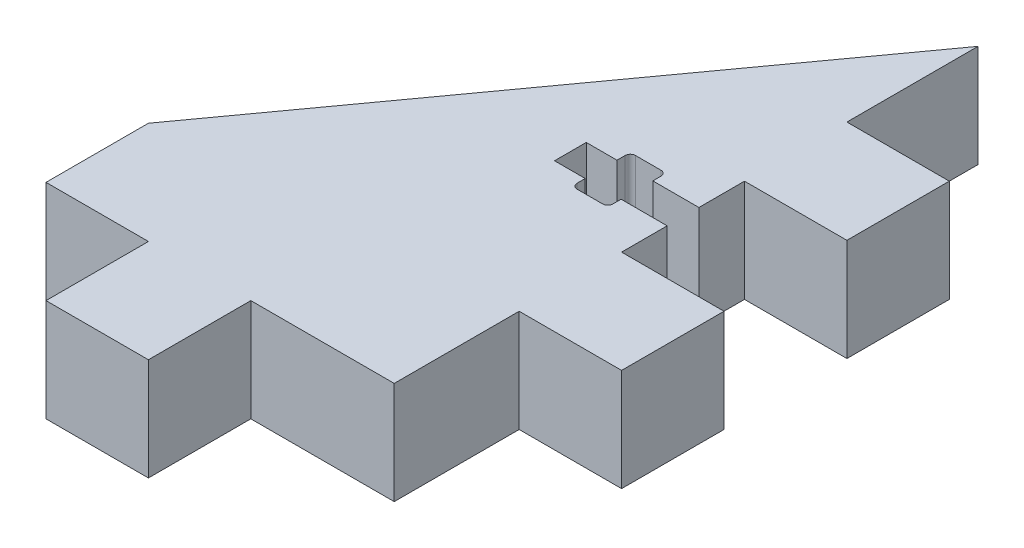
ISO-10303-21;
HEADER;
FILE_DESCRIPTION(('STEP AP214'),'2;1');
FILE_NAME('part.step','',(''),(''),'','','');
FILE_SCHEMA(('AUTOMOTIVE_DESIGN { 1 0 10303 214 1 1 1 1 }'));
ENDSEC;
DATA;
#1=APPLICATION_CONTEXT('core data for automotive mechanical design processes');
#2=APPLICATION_PROTOCOL_DEFINITION('international standard','automotive_design',2000,#1);
#3=PRODUCT_CONTEXT('',#1,'mechanical');
#4=PRODUCT('Part','Part','',(#3));
#5=PRODUCT_RELATED_PRODUCT_CATEGORY('part','',(#4));
#6=PRODUCT_DEFINITION_FORMATION('','',#4);
#7=PRODUCT_DEFINITION_CONTEXT('part definition',#1,'design');
#8=PRODUCT_DEFINITION('design','',#6,#7);
#9=PRODUCT_DEFINITION_SHAPE('','',#8);
#10=(LENGTH_UNIT() NAMED_UNIT(*) SI_UNIT(.MILLI.,.METRE.));
#11=(NAMED_UNIT(*) PLANE_ANGLE_UNIT() SI_UNIT($,.RADIAN.));
#12=(NAMED_UNIT(*) SI_UNIT($,.STERADIAN.) SOLID_ANGLE_UNIT());
#13=UNCERTAINTY_MEASURE_WITH_UNIT(LENGTH_MEASURE(1.E-05),#10,'distance_accuracy_value','');
#14=(GEOMETRIC_REPRESENTATION_CONTEXT(3) GLOBAL_UNCERTAINTY_ASSIGNED_CONTEXT((#13)) GLOBAL_UNIT_ASSIGNED_CONTEXT((#10,
#11,#12)) REPRESENTATION_CONTEXT('',''));
#15=CARTESIAN_POINT('',(0.,0.,0.));
#16=DIRECTION('',(0.,0.,1.));
#17=DIRECTION('',(1.,0.,0.));
#18=AXIS2_PLACEMENT_3D('',#15,#16,#17);
#19=CARTESIAN_POINT('',(0.,10.,-34.2));
#20=DIRECTION('',(-1.,0.,0.));
#21=DIRECTION('',(0.,0.,1.));
#22=AXIS2_PLACEMENT_3D('',#19,#20,#21);
#23=PLANE('',#22);
#24=DIRECTION('',(0.,0.,-1.));
#25=VECTOR('',#24,1.);
#26=CARTESIAN_POINT('',(0.,10.,-34.2));
#27=LINE('',#26,#25);
#28=CARTESIAN_POINT('',(0.,10.,-29.75));
#29=VERTEX_POINT('',#28);
#30=CARTESIAN_POINT('',(0.,10.,-34.2));
#31=VERTEX_POINT('',#30);
#32=EDGE_CURVE('E288',#29,#31,#27,.T.);
#33=ORIENTED_EDGE('',*,*,#32,.F.);
#34=DIRECTION('',(0.,1.,0.));
#35=VECTOR('',#34,1.);
#36=CARTESIAN_POINT('',(0.,0.,-29.75));
#37=LINE('',#36,#35);
#38=CARTESIAN_POINT('',(0.,0.,-29.75));
#39=VERTEX_POINT('',#38);
#40=EDGE_CURVE('E354',#39,#29,#37,.T.);
#41=ORIENTED_EDGE('',*,*,#40,.F.);
#42=DIRECTION('',(0.,0.,-1.));
#43=VECTOR('',#42,1.);
#44=CARTESIAN_POINT('',(0.,0.,-34.2));
#45=LINE('',#44,#43);
#46=CARTESIAN_POINT('',(0.,0.,-34.2));
#47=VERTEX_POINT('',#46);
#48=EDGE_CURVE('E201',#39,#47,#45,.T.);
#49=ORIENTED_EDGE('',*,*,#48,.T.);
#50=DIRECTION('',(0.,-1.,0.));
#51=VECTOR('',#50,1.);
#52=CARTESIAN_POINT('',(0.,10.,-34.2));
#53=LINE('',#52,#51);
#54=EDGE_CURVE('E250',#31,#47,#53,.T.);
#55=ORIENTED_EDGE('',*,*,#54,.F.);
#56=EDGE_LOOP('',(#33,#41,#49,#55));
#57=FACE_BOUND('',#56,.T.);
#58=ADVANCED_FACE('F33',(#57),#23,.F.);
#59=CARTESIAN_POINT('',(0.,10.,-12.2));
#60=DIRECTION('',(-1.,0.,0.));
#61=DIRECTION('',(0.,0.,1.));
#62=AXIS2_PLACEMENT_3D('',#59,#60,#61);
#63=PLANE('',#62);
#64=DIRECTION('',(0.,0.,-1.));
#65=VECTOR('',#64,1.);
#66=CARTESIAN_POINT('',(0.,0.,-12.2));
#67=LINE('',#66,#65);
#68=CARTESIAN_POINT('',(0.,0.,0.));
#69=VERTEX_POINT('',#68);
#70=CARTESIAN_POINT('',(0.,0.,-12.2));
#71=VERTEX_POINT('',#70);
#72=EDGE_CURVE('E191',#69,#71,#67,.T.);
#73=ORIENTED_EDGE('',*,*,#72,.T.);
#74=DIRECTION('',(0.,-1.,0.));
#75=VECTOR('',#74,1.);
#76=CARTESIAN_POINT('',(0.,10.,-12.2));
#77=LINE('',#76,#75);
#78=CARTESIAN_POINT('',(0.,10.,-12.2));
#79=VERTEX_POINT('',#78);
#80=EDGE_CURVE('E11',#79,#71,#77,.T.);
#81=ORIENTED_EDGE('',*,*,#80,.F.);
#82=DIRECTION('',(0.,0.,-1.));
#83=VECTOR('',#82,1.);
#84=CARTESIAN_POINT('',(0.,10.,-12.2));
#85=LINE('',#84,#83);
#86=CARTESIAN_POINT('',(0.,10.,0.));
#87=VERTEX_POINT('',#86);
#88=EDGE_CURVE('E225',#87,#79,#85,.T.);
#89=ORIENTED_EDGE('',*,*,#88,.F.);
#90=DIRECTION('',(0.,-1.,0.));
#91=VECTOR('',#90,1.);
#92=CARTESIAN_POINT('',(0.,10.,0.));
#93=LINE('',#92,#91);
#94=EDGE_CURVE('E187',#87,#69,#93,.T.);
#95=ORIENTED_EDGE('',*,*,#94,.T.);
#96=EDGE_LOOP('',(#73,#81,#89,#95));
#97=FACE_BOUND('',#96,.T.);
#98=ADVANCED_FACE('F35',(#97),#63,.F.);
#99=CARTESIAN_POINT('',(10.,10.,-12.2));
#100=DIRECTION('',(0.,0.,-1.));
#101=DIRECTION('',(-1.,0.,0.));
#102=AXIS2_PLACEMENT_3D('',#99,#100,#101);
#103=PLANE('',#102);
#104=DIRECTION('',(1.,0.,0.));
#105=VECTOR('',#104,1.);
#106=CARTESIAN_POINT('',(10.,0.,-12.2));
#107=LINE('',#106,#105);
#108=CARTESIAN_POINT('',(10.,0.,-12.2));
#109=VERTEX_POINT('',#108);
#110=EDGE_CURVE('E194',#71,#109,#107,.T.);
#111=ORIENTED_EDGE('',*,*,#110,.T.);
#112=DIRECTION('',(0.,-1.,0.));
#113=VECTOR('',#112,1.);
#114=CARTESIAN_POINT('',(10.,10.,-12.2));
#115=LINE('',#114,#113);
#116=CARTESIAN_POINT('',(10.,10.,-12.2));
#117=VERTEX_POINT('',#116);
#118=EDGE_CURVE('E41',#117,#109,#115,.T.);
#119=ORIENTED_EDGE('',*,*,#118,.F.);
#120=DIRECTION('',(1.,0.,0.));
#121=VECTOR('',#120,1.);
#122=CARTESIAN_POINT('',(10.,10.,-12.2));
#123=LINE('',#122,#121);
#124=EDGE_CURVE('E122',#79,#117,#123,.T.);
#125=ORIENTED_EDGE('',*,*,#124,.F.);
#126=ORIENTED_EDGE('',*,*,#80,.T.);
#127=EDGE_LOOP('',(#111,#119,#125,#126));
#128=FACE_BOUND('',#127,.T.);
#129=ADVANCED_FACE('F598',(#128),#103,.F.);
#130=CARTESIAN_POINT('',(9.99999999999999,10.,-22.2));
#131=DIRECTION('',(-1.,0.,0.));
#132=DIRECTION('',(0.,0.,1.));
#133=AXIS2_PLACEMENT_3D('',#130,#131,#132);
#134=PLANE('',#133);
#135=DIRECTION('',(0.,0.,-1.));
#136=VECTOR('',#135,1.);
#137=CARTESIAN_POINT('',(9.99999999999999,0.,-22.2));
#138=LINE('',#137,#136);
#139=CARTESIAN_POINT('',(9.99999999999999,0.,-22.2));
#140=VERTEX_POINT('',#139);
#141=EDGE_CURVE('E197',#109,#140,#138,.T.);
#142=ORIENTED_EDGE('',*,*,#141,.T.);
#143=DIRECTION('',(0.,-1.,0.));
#144=VECTOR('',#143,1.);
#145=CARTESIAN_POINT('',(9.99999999999999,10.,-22.2));
#146=LINE('',#145,#144);
#147=CARTESIAN_POINT('',(9.99999999999999,10.,-22.2));
#148=VERTEX_POINT('',#147);
#149=EDGE_CURVE('E256',#148,#140,#146,.T.);
#150=ORIENTED_EDGE('',*,*,#149,.F.);
#151=DIRECTION('',(0.,0.,-1.));
#152=VECTOR('',#151,1.);
#153=CARTESIAN_POINT('',(9.99999999999999,10.,-22.2));
#154=LINE('',#153,#152);
#155=EDGE_CURVE('E264',#117,#148,#154,.T.);
#156=ORIENTED_EDGE('',*,*,#155,.F.);
#157=ORIENTED_EDGE('',*,*,#118,.T.);
#158=EDGE_LOOP('',(#142,#150,#156,#157));
#159=FACE_BOUND('',#158,.T.);
#160=ADVANCED_FACE('F262',(#159),#134,.F.);
#161=CARTESIAN_POINT('',(0.,10.,-22.2));
#162=DIRECTION('',(0.,0.,1.));
#163=DIRECTION('',(1.,0.,0.));
#164=AXIS2_PLACEMENT_3D('',#161,#162,#163);
#165=PLANE('',#164);
#166=DIRECTION('',(-1.,0.,0.));
#167=VECTOR('',#166,1.);
#168=CARTESIAN_POINT('',(0.,0.,-22.2));
#169=LINE('',#168,#167);
#170=CARTESIAN_POINT('',(0.,0.,-22.2));
#171=VERTEX_POINT('',#170);
#172=EDGE_CURVE('E199',#140,#171,#169,.T.);
#173=ORIENTED_EDGE('',*,*,#172,.T.);
#174=DIRECTION('',(0.,-1.,0.));
#175=VECTOR('',#174,1.);
#176=CARTESIAN_POINT('',(0.,10.,-22.2));
#177=LINE('',#176,#175);
#178=CARTESIAN_POINT('',(0.,10.,-22.2));
#179=VERTEX_POINT('',#178);
#180=EDGE_CURVE('E253',#179,#171,#177,.T.);
#181=ORIENTED_EDGE('',*,*,#180,.F.);
#182=DIRECTION('',(-1.,0.,0.));
#183=VECTOR('',#182,1.);
#184=CARTESIAN_POINT('',(0.,10.,-22.2));
#185=LINE('',#184,#183);
#186=EDGE_CURVE('E292',#148,#179,#185,.T.);
#187=ORIENTED_EDGE('',*,*,#186,.F.);
#188=ORIENTED_EDGE('',*,*,#149,.T.);
#189=EDGE_LOOP('',(#173,#181,#187,#188));
#190=FACE_BOUND('',#189,.T.);
#191=ADVANCED_FACE('F274',(#190),#165,.F.);
#192=CARTESIAN_POINT('',(0.,0.,-26.65));
#193=VERTEX_POINT('',#192);
#194=EDGE_CURVE('E202',#171,#193,#45,.T.);
#195=ORIENTED_EDGE('',*,*,#194,.T.);
#196=DIRECTION('',(0.,1.,0.));
#197=VECTOR('',#196,1.);
#198=CARTESIAN_POINT('',(0.,0.,-26.65));
#199=LINE('',#198,#197);
#200=CARTESIAN_POINT('',(0.,10.,-26.65));
#201=VERTEX_POINT('',#200);
#202=EDGE_CURVE('E285',#193,#201,#199,.T.);
#203=ORIENTED_EDGE('',*,*,#202,.T.);
#204=EDGE_CURVE('E282',#179,#201,#27,.T.);
#205=ORIENTED_EDGE('',*,*,#204,.F.);
#206=ORIENTED_EDGE('',*,*,#180,.T.);
#207=EDGE_LOOP('',(#195,#203,#205,#206));
#208=FACE_BOUND('',#207,.T.);
#209=ADVANCED_FACE('F278',(#208),#23,.F.);
#210=CARTESIAN_POINT('',(9.99999999999999,10.,-34.2));
#211=DIRECTION('',(0.,0.,-1.));
#212=DIRECTION('',(-1.,0.,0.));
#213=AXIS2_PLACEMENT_3D('',#210,#211,#212);
#214=PLANE('',#213);
#215=DIRECTION('',(1.,0.,0.));
#216=VECTOR('',#215,1.);
#217=CARTESIAN_POINT('',(9.99999999999999,0.,-34.2));
#218=LINE('',#217,#216);
#219=CARTESIAN_POINT('',(9.99999999999999,0.,-34.2));
#220=VERTEX_POINT('',#219);
#221=EDGE_CURVE('E205',#47,#220,#218,.T.);
#222=ORIENTED_EDGE('',*,*,#221,.T.);
#223=DIRECTION('',(0.,-1.,0.));
#224=VECTOR('',#223,1.);
#225=CARTESIAN_POINT('',(9.99999999999999,10.,-34.2));
#226=LINE('',#225,#224);
#227=CARTESIAN_POINT('',(9.99999999999999,10.,-34.2));
#228=VERTEX_POINT('',#227);
#229=EDGE_CURVE('E247',#228,#220,#226,.T.);
#230=ORIENTED_EDGE('',*,*,#229,.F.);
#231=DIRECTION('',(1.,0.,0.));
#232=VECTOR('',#231,1.);
#233=CARTESIAN_POINT('',(9.99999999999999,10.,-34.2));
#234=LINE('',#233,#232);
#235=EDGE_CURVE('E287',#31,#228,#234,.T.);
#236=ORIENTED_EDGE('',*,*,#235,.F.);
#237=ORIENTED_EDGE('',*,*,#54,.T.);
#238=EDGE_LOOP('',(#222,#230,#236,#237));
#239=FACE_BOUND('',#238,.T.);
#240=ADVANCED_FACE('F563',(#239),#214,.F.);
#241=CARTESIAN_POINT('',(9.99999999999999,10.,-44.2));
#242=DIRECTION('',(-1.,0.,0.));
#243=DIRECTION('',(0.,0.,1.));
#244=AXIS2_PLACEMENT_3D('',#241,#242,#243);
#245=PLANE('',#244);
#246=DIRECTION('',(0.,0.,-1.));
#247=VECTOR('',#246,1.);
#248=CARTESIAN_POINT('',(9.99999999999999,0.,-44.2));
#249=LINE('',#248,#247);
#250=CARTESIAN_POINT('',(9.99999999999999,0.,-44.2));
#251=VERTEX_POINT('',#250);
#252=EDGE_CURVE('E207',#220,#251,#249,.T.);
#253=ORIENTED_EDGE('',*,*,#252,.T.);
#254=DIRECTION('',(0.,-1.,0.));
#255=VECTOR('',#254,1.);
#256=CARTESIAN_POINT('',(9.99999999999999,10.,-44.2));
#257=LINE('',#256,#255);
#258=CARTESIAN_POINT('',(9.99999999999999,10.,-44.2));
#259=VERTEX_POINT('',#258);
#260=EDGE_CURVE('E244',#259,#251,#257,.T.);
#261=ORIENTED_EDGE('',*,*,#260,.F.);
#262=DIRECTION('',(0.,0.,-1.));
#263=VECTOR('',#262,1.);
#264=CARTESIAN_POINT('',(9.99999999999999,10.,-44.2));
#265=LINE('',#264,#263);
#266=EDGE_CURVE('E290',#228,#259,#265,.T.);
#267=ORIENTED_EDGE('',*,*,#266,.F.);
#268=ORIENTED_EDGE('',*,*,#229,.T.);
#269=EDGE_LOOP('',(#253,#261,#267,#268));
#270=FACE_BOUND('',#269,.T.);
#271=ADVANCED_FACE('F566',(#270),#245,.F.);
#272=CARTESIAN_POINT('',(0.,10.,-44.2));
#273=DIRECTION('',(0.,0.,1.));
#274=DIRECTION('',(1.,0.,0.));
#275=AXIS2_PLACEMENT_3D('',#272,#273,#274);
#276=PLANE('',#275);
#277=DIRECTION('',(-1.,0.,0.));
#278=VECTOR('',#277,1.);
#279=CARTESIAN_POINT('',(0.,0.,-44.2));
#280=LINE('',#279,#278);
#281=CARTESIAN_POINT('',(0.,0.,-44.2));
#282=VERTEX_POINT('',#281);
#283=EDGE_CURVE('E209',#251,#282,#280,.T.);
#284=ORIENTED_EDGE('',*,*,#283,.T.);
#285=DIRECTION('',(0.,-1.,0.));
#286=VECTOR('',#285,1.);
#287=CARTESIAN_POINT('',(0.,10.,-44.2));
#288=LINE('',#287,#286);
#289=CARTESIAN_POINT('',(0.,10.,-44.2));
#290=VERTEX_POINT('',#289);
#291=EDGE_CURVE('E241',#290,#282,#288,.T.);
#292=ORIENTED_EDGE('',*,*,#291,.F.);
#293=DIRECTION('',(-1.,0.,0.));
#294=VECTOR('',#293,1.);
#295=CARTESIAN_POINT('',(0.,10.,-44.2));
#296=LINE('',#295,#294);
#297=EDGE_CURVE('E297',#259,#290,#296,.T.);
#298=ORIENTED_EDGE('',*,*,#297,.F.);
#299=ORIENTED_EDGE('',*,*,#260,.T.);
#300=EDGE_LOOP('',(#284,#292,#298,#299));
#301=FACE_BOUND('',#300,.T.);
#302=ADVANCED_FACE('F571',(#301),#276,.F.);
#303=CARTESIAN_POINT('',(0.,10.,-57.));
#304=DIRECTION('',(-1.,0.,0.));
#305=DIRECTION('',(0.,0.,1.));
#306=AXIS2_PLACEMENT_3D('',#303,#304,#305);
#307=PLANE('',#306);
#308=DIRECTION('',(0.,0.,-1.));
#309=VECTOR('',#308,1.);
#310=CARTESIAN_POINT('',(0.,0.,-57.));
#311=LINE('',#310,#309);
#312=CARTESIAN_POINT('',(0.,0.,-57.));
#313=VERTEX_POINT('',#312);
#314=EDGE_CURVE('E211',#282,#313,#311,.T.);
#315=ORIENTED_EDGE('',*,*,#314,.T.);
#316=DIRECTION('',(0.,-1.,0.));
#317=VECTOR('',#316,1.);
#318=CARTESIAN_POINT('',(0.,10.,-57.));
#319=LINE('',#318,#317);
#320=CARTESIAN_POINT('',(0.,10.,-57.));
#321=VERTEX_POINT('',#320);
#322=EDGE_CURVE('E238',#321,#313,#319,.T.);
#323=ORIENTED_EDGE('',*,*,#322,.F.);
#324=DIRECTION('',(0.,0.,-1.));
#325=VECTOR('',#324,1.);
#326=CARTESIAN_POINT('',(0.,10.,-57.));
#327=LINE('',#326,#325);
#328=EDGE_CURVE('E299',#290,#321,#327,.T.);
#329=ORIENTED_EDGE('',*,*,#328,.F.);
#330=ORIENTED_EDGE('',*,*,#291,.T.);
#331=EDGE_LOOP('',(#315,#323,#329,#330));
#332=FACE_BOUND('',#331,.T.);
#333=ADVANCED_FACE('F577',(#332),#307,.F.);
#334=CARTESIAN_POINT('',(-34.,10.,-10.));
#335=DIRECTION('',(0.810224410789705,0.,0.586119786528723));
#336=DIRECTION('',(0.586119786528723,0.,-0.810224410789705));
#337=AXIS2_PLACEMENT_3D('',#334,#335,#336);
#338=PLANE('',#337);
#339=DIRECTION('',(-0.586119786528723,0.,0.810224410789705));
#340=VECTOR('',#339,1.);
#341=CARTESIAN_POINT('',(-34.,0.,-10.));
#342=LINE('',#341,#340);
#343=CARTESIAN_POINT('',(-34.,0.,-10.));
#344=VERTEX_POINT('',#343);
#345=EDGE_CURVE('E213',#313,#344,#342,.T.);
#346=ORIENTED_EDGE('',*,*,#345,.T.);
#347=DIRECTION('',(0.,-1.,0.));
#348=VECTOR('',#347,1.);
#349=CARTESIAN_POINT('',(-34.,10.,-10.));
#350=LINE('',#349,#348);
#351=CARTESIAN_POINT('',(-34.,10.,-10.));
#352=VERTEX_POINT('',#351);
#353=EDGE_CURVE('E235',#352,#344,#350,.T.);
#354=ORIENTED_EDGE('',*,*,#353,.F.);
#355=DIRECTION('',(-0.586119786528723,0.,0.810224410789705));
#356=VECTOR('',#355,1.);
#357=CARTESIAN_POINT('',(-34.,10.,-10.));
#358=LINE('',#357,#356);
#359=EDGE_CURVE('E301',#321,#352,#358,.T.);
#360=ORIENTED_EDGE('',*,*,#359,.F.);
#361=ORIENTED_EDGE('',*,*,#322,.T.);
#362=EDGE_LOOP('',(#346,#354,#360,#361));
#363=FACE_BOUND('',#362,.T.);
#364=ADVANCED_FACE('F581',(#363),#338,.F.);
#365=CARTESIAN_POINT('',(-34.,10.,0.));
#366=DIRECTION('',(1.,0.,0.));
#367=DIRECTION('',(0.,0.,-1.));
#368=AXIS2_PLACEMENT_3D('',#365,#366,#367);
#369=PLANE('',#368);
#370=DIRECTION('',(0.,0.,1.));
#371=VECTOR('',#370,1.);
#372=CARTESIAN_POINT('',(-34.,0.,0.));
#373=LINE('',#372,#371);
#374=CARTESIAN_POINT('',(-34.,0.,0.));
#375=VERTEX_POINT('',#374);
#376=EDGE_CURVE('E215',#344,#375,#373,.T.);
#377=ORIENTED_EDGE('',*,*,#376,.T.);
#378=DIRECTION('',(0.,-1.,0.));
#379=VECTOR('',#378,1.);
#380=CARTESIAN_POINT('',(-34.,10.,0.));
#381=LINE('',#380,#379);
#382=CARTESIAN_POINT('',(-34.,10.,0.));
#383=VERTEX_POINT('',#382);
#384=EDGE_CURVE('E232',#383,#375,#381,.T.);
#385=ORIENTED_EDGE('',*,*,#384,.F.);
#386=DIRECTION('',(0.,0.,1.));
#387=VECTOR('',#386,1.);
#388=CARTESIAN_POINT('',(-34.,10.,0.));
#389=LINE('',#388,#387);
#390=EDGE_CURVE('E303',#352,#383,#389,.T.);
#391=ORIENTED_EDGE('',*,*,#390,.F.);
#392=ORIENTED_EDGE('',*,*,#353,.T.);
#393=EDGE_LOOP('',(#377,#385,#391,#392));
#394=FACE_BOUND('',#393,.T.);
#395=ADVANCED_FACE('F584',(#394),#369,.F.);
#396=CARTESIAN_POINT('',(-24.,10.,0.));
#397=DIRECTION('',(0.,0.,-1.));
#398=DIRECTION('',(-1.,0.,0.));
#399=AXIS2_PLACEMENT_3D('',#396,#397,#398);
#400=PLANE('',#399);
#401=DIRECTION('',(1.,0.,0.));
#402=VECTOR('',#401,1.);
#403=CARTESIAN_POINT('',(-24.,0.,0.));
#404=LINE('',#403,#402);
#405=CARTESIAN_POINT('',(-24.,0.,0.));
#406=VERTEX_POINT('',#405);
#407=EDGE_CURVE('E217',#375,#406,#404,.T.);
#408=ORIENTED_EDGE('',*,*,#407,.T.);
#409=DIRECTION('',(0.,-1.,0.));
#410=VECTOR('',#409,1.);
#411=CARTESIAN_POINT('',(-24.,10.,0.));
#412=LINE('',#411,#410);
#413=CARTESIAN_POINT('',(-24.,10.,0.));
#414=VERTEX_POINT('',#413);
#415=EDGE_CURVE('E229',#414,#406,#412,.T.);
#416=ORIENTED_EDGE('',*,*,#415,.F.);
#417=DIRECTION('',(1.,0.,0.));
#418=VECTOR('',#417,1.);
#419=CARTESIAN_POINT('',(-24.,10.,0.));
#420=LINE('',#419,#418);
#421=EDGE_CURVE('E305',#383,#414,#420,.T.);
#422=ORIENTED_EDGE('',*,*,#421,.F.);
#423=ORIENTED_EDGE('',*,*,#384,.T.);
#424=EDGE_LOOP('',(#408,#416,#422,#423));
#425=FACE_BOUND('',#424,.T.);
#426=ADVANCED_FACE('F311',(#425),#400,.F.);
#427=CARTESIAN_POINT('',(-24.,10.,10.));
#428=DIRECTION('',(1.,0.,0.));
#429=DIRECTION('',(0.,0.,-1.));
#430=AXIS2_PLACEMENT_3D('',#427,#428,#429);
#431=PLANE('',#430);
#432=DIRECTION('',(0.,0.,1.));
#433=VECTOR('',#432,1.);
#434=CARTESIAN_POINT('',(-24.,0.,10.));
#435=LINE('',#434,#433);
#436=CARTESIAN_POINT('',(-24.,0.,10.));
#437=VERTEX_POINT('',#436);
#438=EDGE_CURVE('E219',#406,#437,#435,.T.);
#439=ORIENTED_EDGE('',*,*,#438,.T.);
#440=DIRECTION('',(0.,-1.,0.));
#441=VECTOR('',#440,1.);
#442=CARTESIAN_POINT('',(-24.,10.,10.));
#443=LINE('',#442,#441);
#444=CARTESIAN_POINT('',(-24.,10.,10.));
#445=VERTEX_POINT('',#444);
#446=EDGE_CURVE('E182',#445,#437,#443,.T.);
#447=ORIENTED_EDGE('',*,*,#446,.F.);
#448=DIRECTION('',(0.,0.,1.));
#449=VECTOR('',#448,1.);
#450=CARTESIAN_POINT('',(-24.,10.,10.));
#451=LINE('',#450,#449);
#452=EDGE_CURVE('E170',#414,#445,#451,.T.);
#453=ORIENTED_EDGE('',*,*,#452,.F.);
#454=ORIENTED_EDGE('',*,*,#415,.T.);
#455=EDGE_LOOP('',(#439,#447,#453,#454));
#456=FACE_BOUND('',#455,.T.);
#457=ADVANCED_FACE('F315',(#456),#431,.F.);
#458=CARTESIAN_POINT('',(-14.,10.,10.));
#459=DIRECTION('',(0.,0.,-1.));
#460=DIRECTION('',(-1.,0.,0.));
#461=AXIS2_PLACEMENT_3D('',#458,#459,#460);
#462=PLANE('',#461);
#463=DIRECTION('',(1.,0.,0.));
#464=VECTOR('',#463,1.);
#465=CARTESIAN_POINT('',(-14.,0.,10.));
#466=LINE('',#465,#464);
#467=CARTESIAN_POINT('',(-14.,0.,10.));
#468=VERTEX_POINT('',#467);
#469=EDGE_CURVE('E179',#437,#468,#466,.T.);
#470=ORIENTED_EDGE('',*,*,#469,.T.);
#471=DIRECTION('',(0.,-1.,0.));
#472=VECTOR('',#471,1.);
#473=CARTESIAN_POINT('',(-14.,10.,10.));
#474=LINE('',#473,#472);
#475=CARTESIAN_POINT('',(-14.,10.,10.));
#476=VERTEX_POINT('',#475);
#477=EDGE_CURVE('E176',#476,#468,#474,.T.);
#478=ORIENTED_EDGE('',*,*,#477,.F.);
#479=DIRECTION('',(1.,0.,0.));
#480=VECTOR('',#479,1.);
#481=CARTESIAN_POINT('',(-14.,10.,10.));
#482=LINE('',#481,#480);
#483=EDGE_CURVE('E162',#445,#476,#482,.T.);
#484=ORIENTED_EDGE('',*,*,#483,.F.);
#485=ORIENTED_EDGE('',*,*,#446,.T.);
#486=EDGE_LOOP('',(#470,#478,#484,#485));
#487=FACE_BOUND('',#486,.T.);
#488=ADVANCED_FACE('F177',(#487),#462,.F.);
#489=CARTESIAN_POINT('',(-14.,10.,0.));
#490=DIRECTION('',(-1.,0.,0.));
#491=DIRECTION('',(0.,0.,1.));
#492=AXIS2_PLACEMENT_3D('',#489,#490,#491);
#493=PLANE('',#492);
#494=DIRECTION('',(0.,0.,-1.));
#495=VECTOR('',#494,1.);
#496=CARTESIAN_POINT('',(-14.,0.,0.));
#497=LINE('',#496,#495);
#498=CARTESIAN_POINT('',(-14.,0.,0.));
#499=VERTEX_POINT('',#498);
#500=EDGE_CURVE('E222',#468,#499,#497,.T.);
#501=ORIENTED_EDGE('',*,*,#500,.T.);
#502=DIRECTION('',(0.,-1.,0.));
#503=VECTOR('',#502,1.);
#504=CARTESIAN_POINT('',(-14.,10.,0.));
#505=LINE('',#504,#503);
#506=CARTESIAN_POINT('',(-14.,10.,0.));
#507=VERTEX_POINT('',#506);
#508=EDGE_CURVE('E183',#507,#499,#505,.T.);
#509=ORIENTED_EDGE('',*,*,#508,.F.);
#510=DIRECTION('',(0.,0.,-1.));
#511=VECTOR('',#510,1.);
#512=CARTESIAN_POINT('',(-14.,10.,0.));
#513=LINE('',#512,#511);
#514=EDGE_CURVE('E167',#476,#507,#513,.T.);
#515=ORIENTED_EDGE('',*,*,#514,.F.);
#516=ORIENTED_EDGE('',*,*,#477,.T.);
#517=EDGE_LOOP('',(#501,#509,#515,#516));
#518=FACE_BOUND('',#517,.T.);
#519=ADVANCED_FACE('F185',(#518),#493,.F.);
#520=CARTESIAN_POINT('',(0.,10.,0.));
#521=DIRECTION('',(0.,0.,-1.));
#522=DIRECTION('',(-1.,0.,0.));
#523=AXIS2_PLACEMENT_3D('',#520,#521,#522);
#524=PLANE('',#523);
#525=DIRECTION('',(1.,0.,0.));
#526=VECTOR('',#525,1.);
#527=CARTESIAN_POINT('',(0.,0.,0.));
#528=LINE('',#527,#526);
#529=EDGE_CURVE('E114',#499,#69,#528,.T.);
#530=ORIENTED_EDGE('',*,*,#529,.T.);
#531=ORIENTED_EDGE('',*,*,#94,.F.);
#532=DIRECTION('',(1.,0.,0.));
#533=VECTOR('',#532,1.);
#534=CARTESIAN_POINT('',(0.,10.,0.));
#535=LINE('',#534,#533);
#536=EDGE_CURVE('E57',#507,#87,#535,.T.);
#537=ORIENTED_EDGE('',*,*,#536,.F.);
#538=ORIENTED_EDGE('',*,*,#508,.T.);
#539=EDGE_LOOP('',(#530,#531,#537,#538));
#540=FACE_BOUND('',#539,.T.);
#541=ADVANCED_FACE('F316',(#540),#524,.F.);
#542=CARTESIAN_POINT('',(0.,10.,0.));
#543=DIRECTION('',(0.,-1.,0.));
#544=DIRECTION('',(0.,0.,-1.));
#545=AXIS2_PLACEMENT_3D('',#542,#543,#544);
#546=PLANE('',#545);
#547=DIRECTION('',(0.,0.,-1.));
#548=VECTOR('',#547,1.);
#549=CARTESIAN_POINT('',(-4.5,10.,-30.55));
#550=LINE('',#549,#548);
#551=CARTESIAN_POINT('',(-4.5,10.,-29.75));
#552=VERTEX_POINT('',#551);
#553=CARTESIAN_POINT('',(-4.5,10.,-30.55));
#554=VERTEX_POINT('',#553);
#555=EDGE_CURVE('E375',#552,#554,#550,.T.);
#556=ORIENTED_EDGE('',*,*,#555,.F.);
#557=DIRECTION('',(-1.,0.,0.));
#558=VECTOR('',#557,1.);
#559=CARTESIAN_POINT('',(-4.5,10.,-29.75));
#560=LINE('',#559,#558);
#561=EDGE_CURVE('E378',#29,#552,#560,.T.);
#562=ORIENTED_EDGE('',*,*,#561,.F.);
#563=ORIENTED_EDGE('',*,*,#32,.T.);
#564=ORIENTED_EDGE('',*,*,#235,.T.);
#565=ORIENTED_EDGE('',*,*,#266,.T.);
#566=ORIENTED_EDGE('',*,*,#297,.T.);
#567=ORIENTED_EDGE('',*,*,#328,.T.);
#568=ORIENTED_EDGE('',*,*,#359,.T.);
#569=ORIENTED_EDGE('',*,*,#390,.T.);
#570=ORIENTED_EDGE('',*,*,#421,.T.);
#571=ORIENTED_EDGE('',*,*,#452,.T.);
#572=ORIENTED_EDGE('',*,*,#483,.T.);
#573=ORIENTED_EDGE('',*,*,#514,.T.);
#574=ORIENTED_EDGE('',*,*,#536,.T.);
#575=ORIENTED_EDGE('',*,*,#88,.T.);
#576=ORIENTED_EDGE('',*,*,#124,.T.);
#577=ORIENTED_EDGE('',*,*,#155,.T.);
#578=ORIENTED_EDGE('',*,*,#186,.T.);
#579=ORIENTED_EDGE('',*,*,#204,.T.);
#580=DIRECTION('',(1.,0.,0.));
#581=VECTOR('',#580,1.);
#582=CARTESIAN_POINT('',(-4.5,10.,-26.65));
#583=LINE('',#582,#581);
#584=CARTESIAN_POINT('',(-4.5,10.,-26.65));
#585=VERTEX_POINT('',#584);
#586=EDGE_CURVE('E381',#585,#201,#583,.T.);
#587=ORIENTED_EDGE('',*,*,#586,.F.);
#588=DIRECTION('',(0.,0.,-1.));
#589=VECTOR('',#588,1.);
#590=CARTESIAN_POINT('',(-4.5,10.,-25.85));
#591=LINE('',#590,#589);
#592=CARTESIAN_POINT('',(-4.5,10.,-25.85));
#593=VERTEX_POINT('',#592);
#594=EDGE_CURVE('E384',#593,#585,#591,.T.);
#595=ORIENTED_EDGE('',*,*,#594,.F.);
#596=CARTESIAN_POINT('',(-5.,10.,-25.85));
#597=DIRECTION('',(0.,1.,0.));
#598=DIRECTION('',(0.,0.,1.));
#599=AXIS2_PLACEMENT_3D('',#596,#597,#598);
#600=CIRCLE('',#599,0.5);
#601=CARTESIAN_POINT('',(-5.,10.,-25.35));
#602=VERTEX_POINT('',#601);
#603=EDGE_CURVE('E387',#602,#593,#600,.T.);
#604=ORIENTED_EDGE('',*,*,#603,.F.);
#605=DIRECTION('',(1.,0.,0.));
#606=VECTOR('',#605,1.);
#607=CARTESIAN_POINT('',(-7.5,10.,-25.35));
#608=LINE('',#607,#606);
#609=CARTESIAN_POINT('',(-7.5,10.,-25.35));
#610=VERTEX_POINT('',#609);
#611=EDGE_CURVE('E390',#610,#602,#608,.T.);
#612=ORIENTED_EDGE('',*,*,#611,.F.);
#613=CARTESIAN_POINT('',(-7.5,10.,-25.85));
#614=DIRECTION('',(0.,1.,0.));
#615=DIRECTION('',(0.,0.,1.));
#616=AXIS2_PLACEMENT_3D('',#613,#614,#615);
#617=CIRCLE('',#616,0.500000000000001);
#618=CARTESIAN_POINT('',(-8.,10.,-25.85));
#619=VERTEX_POINT('',#618);
#620=EDGE_CURVE('E393',#619,#610,#617,.T.);
#621=ORIENTED_EDGE('',*,*,#620,.F.);
#622=DIRECTION('',(0.,0.,1.));
#623=VECTOR('',#622,1.);
#624=CARTESIAN_POINT('',(-8.,10.,-26.65));
#625=LINE('',#624,#623);
#626=CARTESIAN_POINT('',(-8.,10.,-26.65));
#627=VERTEX_POINT('',#626);
#628=EDGE_CURVE('E396',#627,#619,#625,.T.);
#629=ORIENTED_EDGE('',*,*,#628,.F.);
#630=DIRECTION('',(1.,0.,0.));
#631=VECTOR('',#630,1.);
#632=CARTESIAN_POINT('',(-11.,10.,-26.65));
#633=LINE('',#632,#631);
#634=CARTESIAN_POINT('',(-11.,10.,-26.65));
#635=VERTEX_POINT('',#634);
#636=EDGE_CURVE('E399',#635,#627,#633,.T.);
#637=ORIENTED_EDGE('',*,*,#636,.F.);
#638=DIRECTION('',(0.,0.,1.));
#639=VECTOR('',#638,1.);
#640=CARTESIAN_POINT('',(-11.,10.,-29.75));
#641=LINE('',#640,#639);
#642=CARTESIAN_POINT('',(-11.,10.,-29.75));
#643=VERTEX_POINT('',#642);
#644=EDGE_CURVE('E402',#643,#635,#641,.T.);
#645=ORIENTED_EDGE('',*,*,#644,.F.);
#646=DIRECTION('',(-1.,0.,0.));
#647=VECTOR('',#646,1.);
#648=CARTESIAN_POINT('',(-11.,10.,-29.75));
#649=LINE('',#648,#647);
#650=CARTESIAN_POINT('',(-8.,10.,-29.75));
#651=VERTEX_POINT('',#650);
#652=EDGE_CURVE('E405',#651,#643,#649,.T.);
#653=ORIENTED_EDGE('',*,*,#652,.F.);
#654=DIRECTION('',(0.,0.,1.));
#655=VECTOR('',#654,1.);
#656=CARTESIAN_POINT('',(-8.,10.,-29.75));
#657=LINE('',#656,#655);
#658=CARTESIAN_POINT('',(-8.,10.,-30.55));
#659=VERTEX_POINT('',#658);
#660=EDGE_CURVE('E408',#659,#651,#657,.T.);
#661=ORIENTED_EDGE('',*,*,#660,.F.);
#662=CARTESIAN_POINT('',(-7.5,10.,-30.55));
#663=DIRECTION('',(0.,1.,0.));
#664=DIRECTION('',(0.,0.,-1.));
#665=AXIS2_PLACEMENT_3D('',#662,#663,#664);
#666=CIRCLE('',#665,0.5);
#667=CARTESIAN_POINT('',(-7.5,10.,-31.05));
#668=VERTEX_POINT('',#667);
#669=EDGE_CURVE('E411',#668,#659,#666,.T.);
#670=ORIENTED_EDGE('',*,*,#669,.F.);
#671=DIRECTION('',(-1.,0.,0.));
#672=VECTOR('',#671,1.);
#673=CARTESIAN_POINT('',(-7.5,10.,-31.05));
#674=LINE('',#673,#672);
#675=CARTESIAN_POINT('',(-5.,10.,-31.05));
#676=VERTEX_POINT('',#675);
#677=EDGE_CURVE('E368',#676,#668,#674,.T.);
#678=ORIENTED_EDGE('',*,*,#677,.F.);
#679=CARTESIAN_POINT('',(-5.,10.,-30.55));
#680=DIRECTION('',(0.,1.,0.));
#681=DIRECTION('',(0.,0.,-1.));
#682=AXIS2_PLACEMENT_3D('',#679,#680,#681);
#683=CIRCLE('',#682,0.5);
#684=EDGE_CURVE('E372',#554,#676,#683,.T.);
#685=ORIENTED_EDGE('',*,*,#684,.F.);
#686=EDGE_LOOP('',(#556,#562,#563,#564,#565,#566,#567,#568,#569,#570,#571,#572,#573,#574,#575,
#576,#577,#578,#579,#587,#595,#604,#612,#621,#629,#637,#645,#653,#661,#670,#678,#685));
#687=FACE_BOUND('',#686,.T.);
#688=ADVANCED_FACE('F165',(#687),#546,.F.);
#689=CARTESIAN_POINT('',(0.,0.,0.));
#690=DIRECTION('',(0.,-1.,0.));
#691=DIRECTION('',(0.,0.,-1.));
#692=AXIS2_PLACEMENT_3D('',#689,#690,#691);
#693=PLANE('',#692);
#694=DIRECTION('',(-1.,0.,0.));
#695=VECTOR('',#694,1.);
#696=CARTESIAN_POINT('',(-4.5,0.,-29.75));
#697=LINE('',#696,#695);
#698=CARTESIAN_POINT('',(-4.5,0.,-29.75));
#699=VERTEX_POINT('',#698);
#700=EDGE_CURVE('E422',#39,#699,#697,.T.);
#701=ORIENTED_EDGE('',*,*,#700,.T.);
#702=DIRECTION('',(0.,0.,-1.));
#703=VECTOR('',#702,1.);
#704=CARTESIAN_POINT('',(-4.5,0.,-30.55));
#705=LINE('',#704,#703);
#706=CARTESIAN_POINT('',(-4.5,0.,-30.55));
#707=VERTEX_POINT('',#706);
#708=EDGE_CURVE('E419',#699,#707,#705,.T.);
#709=ORIENTED_EDGE('',*,*,#708,.T.);
#710=CARTESIAN_POINT('',(-5.,0.,-30.55));
#711=DIRECTION('',(0.,1.,0.));
#712=DIRECTION('',(0.,0.,-1.));
#713=AXIS2_PLACEMENT_3D('',#710,#711,#712);
#714=CIRCLE('',#713,0.5);
#715=CARTESIAN_POINT('',(-5.,0.,-31.05));
#716=VERTEX_POINT('',#715);
#717=EDGE_CURVE('E416',#707,#716,#714,.T.);
#718=ORIENTED_EDGE('',*,*,#717,.T.);
#719=DIRECTION('',(-1.,0.,0.));
#720=VECTOR('',#719,1.);
#721=CARTESIAN_POINT('',(-7.5,0.,-31.05));
#722=LINE('',#721,#720);
#723=CARTESIAN_POINT('',(-7.5,0.,-31.05));
#724=VERTEX_POINT('',#723);
#725=EDGE_CURVE('E327',#716,#724,#722,.T.);
#726=ORIENTED_EDGE('',*,*,#725,.T.);
#727=CARTESIAN_POINT('',(-7.5,0.,-30.55));
#728=DIRECTION('',(0.,1.,0.));
#729=DIRECTION('',(0.,0.,-1.));
#730=AXIS2_PLACEMENT_3D('',#727,#728,#729);
#731=CIRCLE('',#730,0.5);
#732=CARTESIAN_POINT('',(-8.,0.,-30.55));
#733=VERTEX_POINT('',#732);
#734=EDGE_CURVE('E371',#724,#733,#731,.T.);
#735=ORIENTED_EDGE('',*,*,#734,.T.);
#736=DIRECTION('',(0.,0.,1.));
#737=VECTOR('',#736,1.);
#738=CARTESIAN_POINT('',(-8.,0.,-29.75));
#739=LINE('',#738,#737);
#740=CARTESIAN_POINT('',(-8.,0.,-29.75));
#741=VERTEX_POINT('',#740);
#742=EDGE_CURVE('E448',#733,#741,#739,.T.);
#743=ORIENTED_EDGE('',*,*,#742,.T.);
#744=DIRECTION('',(-1.,0.,0.));
#745=VECTOR('',#744,1.);
#746=CARTESIAN_POINT('',(-11.,0.,-29.75));
#747=LINE('',#746,#745);
#748=CARTESIAN_POINT('',(-11.,0.,-29.75));
#749=VERTEX_POINT('',#748);
#750=EDGE_CURVE('E48',#741,#749,#747,.T.);
#751=ORIENTED_EDGE('',*,*,#750,.T.);
#752=DIRECTION('',(0.,0.,1.));
#753=VECTOR('',#752,1.);
#754=CARTESIAN_POINT('',(-11.,0.,-29.75));
#755=LINE('',#754,#753);
#756=CARTESIAN_POINT('',(-11.,0.,-26.65));
#757=VERTEX_POINT('',#756);
#758=EDGE_CURVE('E444',#749,#757,#755,.T.);
#759=ORIENTED_EDGE('',*,*,#758,.T.);
#760=DIRECTION('',(1.,0.,0.));
#761=VECTOR('',#760,1.);
#762=CARTESIAN_POINT('',(-11.,0.,-26.65));
#763=LINE('',#762,#761);
#764=CARTESIAN_POINT('',(-8.,0.,-26.65));
#765=VERTEX_POINT('',#764);
#766=EDGE_CURVE('E441',#757,#765,#763,.T.);
#767=ORIENTED_EDGE('',*,*,#766,.T.);
#768=DIRECTION('',(0.,0.,1.));
#769=VECTOR('',#768,1.);
#770=CARTESIAN_POINT('',(-8.,0.,-26.65));
#771=LINE('',#770,#769);
#772=CARTESIAN_POINT('',(-8.,0.,-25.85));
#773=VERTEX_POINT('',#772);
#774=EDGE_CURVE('E438',#765,#773,#771,.T.);
#775=ORIENTED_EDGE('',*,*,#774,.T.);
#776=CARTESIAN_POINT('',(-7.5,0.,-25.85));
#777=DIRECTION('',(0.,1.,0.));
#778=DIRECTION('',(0.,0.,1.));
#779=AXIS2_PLACEMENT_3D('',#776,#777,#778);
#780=CIRCLE('',#779,0.500000000000001);
#781=CARTESIAN_POINT('',(-7.5,0.,-25.35));
#782=VERTEX_POINT('',#781);
#783=EDGE_CURVE('E435',#773,#782,#780,.T.);
#784=ORIENTED_EDGE('',*,*,#783,.T.);
#785=DIRECTION('',(1.,0.,0.));
#786=VECTOR('',#785,1.);
#787=CARTESIAN_POINT('',(-7.5,0.,-25.35));
#788=LINE('',#787,#786);
#789=CARTESIAN_POINT('',(-5.,0.,-25.35));
#790=VERTEX_POINT('',#789);
#791=EDGE_CURVE('E432',#782,#790,#788,.T.);
#792=ORIENTED_EDGE('',*,*,#791,.T.);
#793=CARTESIAN_POINT('',(-5.,0.,-25.85));
#794=DIRECTION('',(0.,1.,0.));
#795=DIRECTION('',(0.,0.,1.));
#796=AXIS2_PLACEMENT_3D('',#793,#794,#795);
#797=CIRCLE('',#796,0.5);
#798=CARTESIAN_POINT('',(-4.5,0.,-25.85));
#799=VERTEX_POINT('',#798);
#800=EDGE_CURVE('E429',#790,#799,#797,.T.);
#801=ORIENTED_EDGE('',*,*,#800,.T.);
#802=DIRECTION('',(0.,0.,-1.));
#803=VECTOR('',#802,1.);
#804=CARTESIAN_POINT('',(-4.5,0.,-25.85));
#805=LINE('',#804,#803);
#806=CARTESIAN_POINT('',(-4.5,0.,-26.65));
#807=VERTEX_POINT('',#806);
#808=EDGE_CURVE('E426',#799,#807,#805,.T.);
#809=ORIENTED_EDGE('',*,*,#808,.T.);
#810=DIRECTION('',(1.,0.,0.));
#811=VECTOR('',#810,1.);
#812=CARTESIAN_POINT('',(-4.5,0.,-26.65));
#813=LINE('',#812,#811);
#814=EDGE_CURVE('E424',#807,#193,#813,.T.);
#815=ORIENTED_EDGE('',*,*,#814,.T.);
#816=ORIENTED_EDGE('',*,*,#194,.F.);
#817=ORIENTED_EDGE('',*,*,#172,.F.);
#818=ORIENTED_EDGE('',*,*,#141,.F.);
#819=ORIENTED_EDGE('',*,*,#110,.F.);
#820=ORIENTED_EDGE('',*,*,#72,.F.);
#821=ORIENTED_EDGE('',*,*,#529,.F.);
#822=ORIENTED_EDGE('',*,*,#500,.F.);
#823=ORIENTED_EDGE('',*,*,#469,.F.);
#824=ORIENTED_EDGE('',*,*,#438,.F.);
#825=ORIENTED_EDGE('',*,*,#407,.F.);
#826=ORIENTED_EDGE('',*,*,#376,.F.);
#827=ORIENTED_EDGE('',*,*,#345,.F.);
#828=ORIENTED_EDGE('',*,*,#314,.F.);
#829=ORIENTED_EDGE('',*,*,#283,.F.);
#830=ORIENTED_EDGE('',*,*,#252,.F.);
#831=ORIENTED_EDGE('',*,*,#221,.F.);
#832=ORIENTED_EDGE('',*,*,#48,.F.);
#833=EDGE_LOOP('',(#701,#709,#718,#726,#735,#743,#751,#759,#767,#775,#784,#792,#801,#809,#815,
#816,#817,#818,#819,#820,#821,#822,#823,#824,#825,#826,#827,#828,#829,#830,#831,#832));
#834=FACE_BOUND('',#833,.T.);
#835=ADVANCED_FACE('F268',(#834),#693,.T.);
#836=CARTESIAN_POINT('',(-7.5,0.,-30.55));
#837=DIRECTION('',(0.,1.,0.));
#838=DIRECTION('',(0.,0.,1.));
#839=AXIS2_PLACEMENT_3D('',#836,#837,#838);
#840=CYLINDRICAL_SURFACE('',#839,0.5);
#841=ORIENTED_EDGE('',*,*,#669,.T.);
#842=DIRECTION('',(0.,1.,0.));
#843=VECTOR('',#842,1.);
#844=CARTESIAN_POINT('',(-8.,0.,-30.55));
#845=LINE('',#844,#843);
#846=EDGE_CURVE('E323',#733,#659,#845,.T.);
#847=ORIENTED_EDGE('',*,*,#846,.F.);
#848=ORIENTED_EDGE('',*,*,#734,.F.);
#849=DIRECTION('',(0.,1.,0.));
#850=VECTOR('',#849,1.);
#851=CARTESIAN_POINT('',(-7.5,0.,-31.05));
#852=LINE('',#851,#850);
#853=EDGE_CURVE('E195',#724,#668,#852,.T.);
#854=ORIENTED_EDGE('',*,*,#853,.T.);
#855=EDGE_LOOP('',(#841,#847,#848,#854));
#856=FACE_BOUND('',#855,.T.);
#857=ADVANCED_FACE('F460',(#856),#840,.F.);
#858=CARTESIAN_POINT('',(-7.5,0.,-31.05));
#859=DIRECTION('',(0.,0.,-1.));
#860=DIRECTION('',(-1.,0.,0.));
#861=AXIS2_PLACEMENT_3D('',#858,#859,#860);
#862=PLANE('',#861);
#863=ORIENTED_EDGE('',*,*,#677,.T.);
#864=ORIENTED_EDGE('',*,*,#853,.F.);
#865=ORIENTED_EDGE('',*,*,#725,.F.);
#866=DIRECTION('',(0.,1.,0.));
#867=VECTOR('',#866,1.);
#868=CARTESIAN_POINT('',(-5.,0.,-31.05));
#869=LINE('',#868,#867);
#870=EDGE_CURVE('E363',#716,#676,#869,.T.);
#871=ORIENTED_EDGE('',*,*,#870,.T.);
#872=EDGE_LOOP('',(#863,#864,#865,#871));
#873=FACE_BOUND('',#872,.T.);
#874=ADVANCED_FACE('F497',(#873),#862,.F.);
#875=CARTESIAN_POINT('',(-5.,0.,-30.55));
#876=DIRECTION('',(0.,1.,0.));
#877=DIRECTION('',(0.,0.,1.));
#878=AXIS2_PLACEMENT_3D('',#875,#876,#877);
#879=CYLINDRICAL_SURFACE('',#878,0.5);
#880=ORIENTED_EDGE('',*,*,#684,.T.);
#881=ORIENTED_EDGE('',*,*,#870,.F.);
#882=ORIENTED_EDGE('',*,*,#717,.F.);
#883=DIRECTION('',(0.,1.,0.));
#884=VECTOR('',#883,1.);
#885=CARTESIAN_POINT('',(-4.5,0.,-30.55));
#886=LINE('',#885,#884);
#887=EDGE_CURVE('E360',#707,#554,#886,.T.);
#888=ORIENTED_EDGE('',*,*,#887,.T.);
#889=EDGE_LOOP('',(#880,#881,#882,#888));
#890=FACE_BOUND('',#889,.T.);
#891=ADVANCED_FACE('F503',(#890),#879,.F.);
#892=CARTESIAN_POINT('',(-4.5,0.,-30.55));
#893=DIRECTION('',(1.,0.,0.));
#894=DIRECTION('',(0.,0.,-1.));
#895=AXIS2_PLACEMENT_3D('',#892,#893,#894);
#896=PLANE('',#895);
#897=ORIENTED_EDGE('',*,*,#555,.T.);
#898=ORIENTED_EDGE('',*,*,#887,.F.);
#899=ORIENTED_EDGE('',*,*,#708,.F.);
#900=DIRECTION('',(0.,1.,0.));
#901=VECTOR('',#900,1.);
#902=CARTESIAN_POINT('',(-4.5,0.,-29.75));
#903=LINE('',#902,#901);
#904=EDGE_CURVE('E357',#699,#552,#903,.T.);
#905=ORIENTED_EDGE('',*,*,#904,.T.);
#906=EDGE_LOOP('',(#897,#898,#899,#905));
#907=FACE_BOUND('',#906,.T.);
#908=ADVANCED_FACE('F548',(#907),#896,.F.);
#909=CARTESIAN_POINT('',(-4.5,0.,-29.75));
#910=DIRECTION('',(0.,0.,-1.));
#911=DIRECTION('',(-1.,0.,0.));
#912=AXIS2_PLACEMENT_3D('',#909,#910,#911);
#913=PLANE('',#912);
#914=ORIENTED_EDGE('',*,*,#561,.T.);
#915=ORIENTED_EDGE('',*,*,#904,.F.);
#916=ORIENTED_EDGE('',*,*,#700,.F.);
#917=ORIENTED_EDGE('',*,*,#40,.T.);
#918=EDGE_LOOP('',(#914,#915,#916,#917));
#919=FACE_BOUND('',#918,.T.);
#920=ADVANCED_FACE('F553',(#919),#913,.F.);
#921=CARTESIAN_POINT('',(-4.5,0.,-26.65));
#922=DIRECTION('',(0.,0.,1.));
#923=DIRECTION('',(1.,0.,0.));
#924=AXIS2_PLACEMENT_3D('',#921,#922,#923);
#925=PLANE('',#924);
#926=ORIENTED_EDGE('',*,*,#586,.T.);
#927=ORIENTED_EDGE('',*,*,#202,.F.);
#928=ORIENTED_EDGE('',*,*,#814,.F.);
#929=DIRECTION('',(0.,1.,0.));
#930=VECTOR('',#929,1.);
#931=CARTESIAN_POINT('',(-4.5,0.,-26.65));
#932=LINE('',#931,#930);
#933=EDGE_CURVE('E350',#807,#585,#932,.T.);
#934=ORIENTED_EDGE('',*,*,#933,.T.);
#935=EDGE_LOOP('',(#926,#927,#928,#934));
#936=FACE_BOUND('',#935,.T.);
#937=ADVANCED_FACE('F766',(#936),#925,.F.);
#938=CARTESIAN_POINT('',(-4.5,0.,-25.85));
#939=DIRECTION('',(1.,0.,0.));
#940=DIRECTION('',(0.,0.,-1.));
#941=AXIS2_PLACEMENT_3D('',#938,#939,#940);
#942=PLANE('',#941);
#943=ORIENTED_EDGE('',*,*,#594,.T.);
#944=ORIENTED_EDGE('',*,*,#933,.F.);
#945=ORIENTED_EDGE('',*,*,#808,.F.);
#946=DIRECTION('',(0.,1.,0.));
#947=VECTOR('',#946,1.);
#948=CARTESIAN_POINT('',(-4.5,0.,-25.85));
#949=LINE('',#948,#947);
#950=EDGE_CURVE('E347',#799,#593,#949,.T.);
#951=ORIENTED_EDGE('',*,*,#950,.T.);
#952=EDGE_LOOP('',(#943,#944,#945,#951));
#953=FACE_BOUND('',#952,.T.);
#954=ADVANCED_FACE('F775',(#953),#942,.F.);
#955=CARTESIAN_POINT('',(-5.,0.,-25.85));
#956=DIRECTION('',(0.,1.,0.));
#957=DIRECTION('',(0.,0.,1.));
#958=AXIS2_PLACEMENT_3D('',#955,#956,#957);
#959=CYLINDRICAL_SURFACE('',#958,0.5);
#960=ORIENTED_EDGE('',*,*,#603,.T.);
#961=ORIENTED_EDGE('',*,*,#950,.F.);
#962=ORIENTED_EDGE('',*,*,#800,.F.);
#963=DIRECTION('',(0.,1.,0.));
#964=VECTOR('',#963,1.);
#965=CARTESIAN_POINT('',(-5.,0.,-25.35));
#966=LINE('',#965,#964);
#967=EDGE_CURVE('E344',#790,#602,#966,.T.);
#968=ORIENTED_EDGE('',*,*,#967,.T.);
#969=EDGE_LOOP('',(#960,#961,#962,#968));
#970=FACE_BOUND('',#969,.T.);
#971=ADVANCED_FACE('F785',(#970),#959,.F.);
#972=CARTESIAN_POINT('',(-7.5,0.,-25.35));
#973=DIRECTION('',(0.,0.,1.));
#974=DIRECTION('',(1.,0.,0.));
#975=AXIS2_PLACEMENT_3D('',#972,#973,#974);
#976=PLANE('',#975);
#977=ORIENTED_EDGE('',*,*,#611,.T.);
#978=ORIENTED_EDGE('',*,*,#967,.F.);
#979=ORIENTED_EDGE('',*,*,#791,.F.);
#980=DIRECTION('',(0.,1.,0.));
#981=VECTOR('',#980,1.);
#982=CARTESIAN_POINT('',(-7.5,0.,-25.35));
#983=LINE('',#982,#981);
#984=EDGE_CURVE('E341',#782,#610,#983,.T.);
#985=ORIENTED_EDGE('',*,*,#984,.T.);
#986=EDGE_LOOP('',(#977,#978,#979,#985));
#987=FACE_BOUND('',#986,.T.);
#988=ADVANCED_FACE('F795',(#987),#976,.F.);
#989=CARTESIAN_POINT('',(-7.5,0.,-25.85));
#990=DIRECTION('',(0.,1.,0.));
#991=DIRECTION('',(0.,0.,1.));
#992=AXIS2_PLACEMENT_3D('',#989,#990,#991);
#993=CYLINDRICAL_SURFACE('',#992,0.500000000000001);
#994=ORIENTED_EDGE('',*,*,#620,.T.);
#995=ORIENTED_EDGE('',*,*,#984,.F.);
#996=ORIENTED_EDGE('',*,*,#783,.F.);
#997=DIRECTION('',(0.,1.,0.));
#998=VECTOR('',#997,1.);
#999=CARTESIAN_POINT('',(-8.,0.,-25.85));
#1000=LINE('',#999,#998);
#1001=EDGE_CURVE('E338',#773,#619,#1000,.T.);
#1002=ORIENTED_EDGE('',*,*,#1001,.T.);
#1003=EDGE_LOOP('',(#994,#995,#996,#1002));
#1004=FACE_BOUND('',#1003,.T.);
#1005=ADVANCED_FACE('F805',(#1004),#993,.F.);
#1006=CARTESIAN_POINT('',(-8.,0.,-26.65));
#1007=DIRECTION('',(-1.,0.,0.));
#1008=DIRECTION('',(0.,0.,1.));
#1009=AXIS2_PLACEMENT_3D('',#1006,#1007,#1008);
#1010=PLANE('',#1009);
#1011=ORIENTED_EDGE('',*,*,#628,.T.);
#1012=ORIENTED_EDGE('',*,*,#1001,.F.);
#1013=ORIENTED_EDGE('',*,*,#774,.F.);
#1014=DIRECTION('',(0.,1.,0.));
#1015=VECTOR('',#1014,1.);
#1016=CARTESIAN_POINT('',(-8.,0.,-26.65));
#1017=LINE('',#1016,#1015);
#1018=EDGE_CURVE('E335',#765,#627,#1017,.T.);
#1019=ORIENTED_EDGE('',*,*,#1018,.T.);
#1020=EDGE_LOOP('',(#1011,#1012,#1013,#1019));
#1021=FACE_BOUND('',#1020,.T.);
#1022=ADVANCED_FACE('F815',(#1021),#1010,.F.);
#1023=CARTESIAN_POINT('',(-11.,0.,-26.65));
#1024=DIRECTION('',(0.,0.,1.));
#1025=DIRECTION('',(1.,0.,0.));
#1026=AXIS2_PLACEMENT_3D('',#1023,#1024,#1025);
#1027=PLANE('',#1026);
#1028=ORIENTED_EDGE('',*,*,#636,.T.);
#1029=ORIENTED_EDGE('',*,*,#1018,.F.);
#1030=ORIENTED_EDGE('',*,*,#766,.F.);
#1031=DIRECTION('',(0.,1.,0.));
#1032=VECTOR('',#1031,1.);
#1033=CARTESIAN_POINT('',(-11.,0.,-26.65));
#1034=LINE('',#1033,#1032);
#1035=EDGE_CURVE('E332',#757,#635,#1034,.T.);
#1036=ORIENTED_EDGE('',*,*,#1035,.T.);
#1037=EDGE_LOOP('',(#1028,#1029,#1030,#1036));
#1038=FACE_BOUND('',#1037,.T.);
#1039=ADVANCED_FACE('F825',(#1038),#1027,.F.);
#1040=CARTESIAN_POINT('',(-11.,0.,-29.75));
#1041=DIRECTION('',(-1.,0.,0.));
#1042=DIRECTION('',(0.,0.,1.));
#1043=AXIS2_PLACEMENT_3D('',#1040,#1041,#1042);
#1044=PLANE('',#1043);
#1045=ORIENTED_EDGE('',*,*,#644,.T.);
#1046=ORIENTED_EDGE('',*,*,#1035,.F.);
#1047=ORIENTED_EDGE('',*,*,#758,.F.);
#1048=DIRECTION('',(0.,1.,0.));
#1049=VECTOR('',#1048,1.);
#1050=CARTESIAN_POINT('',(-11.,0.,-29.75));
#1051=LINE('',#1050,#1049);
#1052=EDGE_CURVE('E329',#749,#643,#1051,.T.);
#1053=ORIENTED_EDGE('',*,*,#1052,.T.);
#1054=EDGE_LOOP('',(#1045,#1046,#1047,#1053));
#1055=FACE_BOUND('',#1054,.T.);
#1056=ADVANCED_FACE('F516',(#1055),#1044,.F.);
#1057=CARTESIAN_POINT('',(-11.,0.,-29.75));
#1058=DIRECTION('',(0.,0.,-1.));
#1059=DIRECTION('',(-1.,0.,0.));
#1060=AXIS2_PLACEMENT_3D('',#1057,#1058,#1059);
#1061=PLANE('',#1060);
#1062=ORIENTED_EDGE('',*,*,#652,.T.);
#1063=ORIENTED_EDGE('',*,*,#1052,.F.);
#1064=ORIENTED_EDGE('',*,*,#750,.F.);
#1065=DIRECTION('',(0.,1.,0.));
#1066=VECTOR('',#1065,1.);
#1067=CARTESIAN_POINT('',(-8.,0.,-29.75));
#1068=LINE('',#1067,#1066);
#1069=EDGE_CURVE('E326',#741,#651,#1068,.T.);
#1070=ORIENTED_EDGE('',*,*,#1069,.T.);
#1071=EDGE_LOOP('',(#1062,#1063,#1064,#1070));
#1072=FACE_BOUND('',#1071,.T.);
#1073=ADVANCED_FACE('F510',(#1072),#1061,.F.);
#1074=CARTESIAN_POINT('',(-8.,0.,-29.75));
#1075=DIRECTION('',(-1.,0.,0.));
#1076=DIRECTION('',(0.,0.,1.));
#1077=AXIS2_PLACEMENT_3D('',#1074,#1075,#1076);
#1078=PLANE('',#1077);
#1079=ORIENTED_EDGE('',*,*,#660,.T.);
#1080=ORIENTED_EDGE('',*,*,#1069,.F.);
#1081=ORIENTED_EDGE('',*,*,#742,.F.);
#1082=ORIENTED_EDGE('',*,*,#846,.T.);
#1083=EDGE_LOOP('',(#1079,#1080,#1081,#1082));
#1084=FACE_BOUND('',#1083,.T.);
#1085=ADVANCED_FACE('F509',(#1084),#1078,.F.);
#1086=CLOSED_SHELL('',(#58,#98,#129,#160,#191,#209,#240,#271,#302,#333,#364,#395,#426,#457,#488,
#519,#541,#688,#835,#857,#874,#891,#908,#920,#937,#954,#971,#988,#1005,#1022,#1039,#1056,#1073,#1085));
#1087=MANIFOLD_SOLID_BREP('B2',#1086);
#1088=ADVANCED_BREP_SHAPE_REPRESENTATION('',(#18,#1087),#14);
#1089=SHAPE_DEFINITION_REPRESENTATION(#9,#1088);
ENDSEC;
END-ISO-10303-21;
